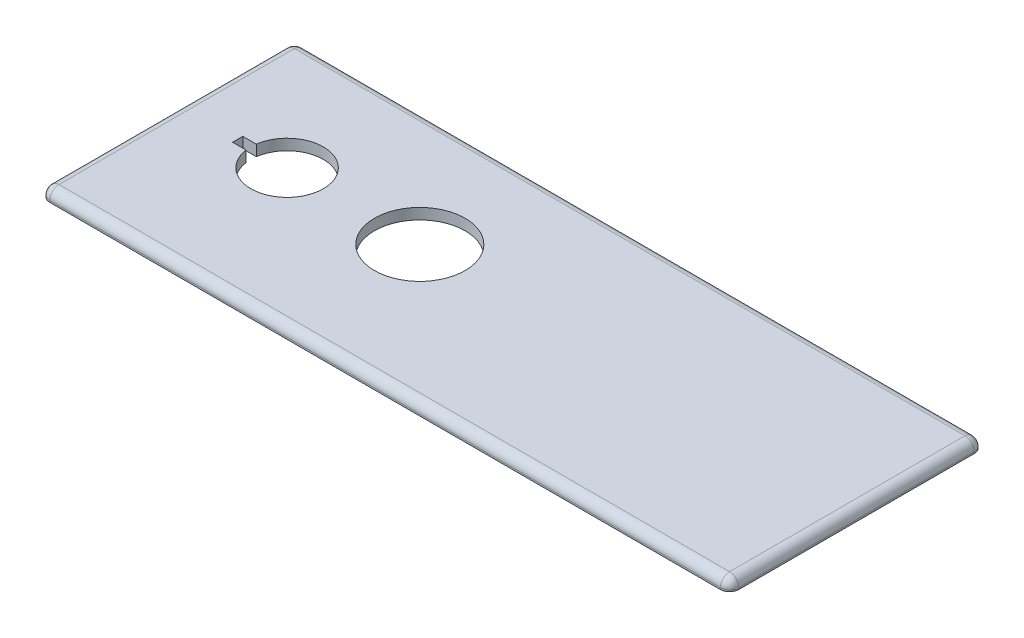
ISO-10303-21;
HEADER;
FILE_DESCRIPTION(('STEP AP214'),'2;1');
FILE_NAME('part.step','',(''),(''),'','','');
FILE_SCHEMA(('AUTOMOTIVE_DESIGN { 1 0 10303 214 1 1 1 1 }'));
ENDSEC;
DATA;
#1=APPLICATION_CONTEXT('core data for automotive mechanical design processes');
#2=APPLICATION_PROTOCOL_DEFINITION('international standard','automotive_design',2000,#1);
#3=PRODUCT_CONTEXT('',#1,'mechanical');
#4=PRODUCT('Part','Part','',(#3));
#5=PRODUCT_RELATED_PRODUCT_CATEGORY('part','',(#4));
#6=PRODUCT_DEFINITION_FORMATION('','',#4);
#7=PRODUCT_DEFINITION_CONTEXT('part definition',#1,'design');
#8=PRODUCT_DEFINITION('design','',#6,#7);
#9=PRODUCT_DEFINITION_SHAPE('','',#8);
#10=(LENGTH_UNIT() NAMED_UNIT(*) SI_UNIT(.MILLI.,.METRE.));
#11=(NAMED_UNIT(*) PLANE_ANGLE_UNIT() SI_UNIT($,.RADIAN.));
#12=(NAMED_UNIT(*) SI_UNIT($,.STERADIAN.) SOLID_ANGLE_UNIT());
#13=UNCERTAINTY_MEASURE_WITH_UNIT(LENGTH_MEASURE(1.E-05),#10,'distance_accuracy_value','');
#14=(GEOMETRIC_REPRESENTATION_CONTEXT(3) GLOBAL_UNCERTAINTY_ASSIGNED_CONTEXT((#13)) GLOBAL_UNIT_ASSIGNED_CONTEXT((#10,
#11,#12)) REPRESENTATION_CONTEXT('',''));
#15=CARTESIAN_POINT('',(0.,0.,0.));
#16=DIRECTION('',(0.,0.,1.));
#17=DIRECTION('',(1.,0.,0.));
#18=AXIS2_PLACEMENT_3D('',#15,#16,#17);
#19=CARTESIAN_POINT('',(95.,3.,35.));
#20=DIRECTION('',(-1.,0.,0.));
#21=DIRECTION('',(0.,0.,1.));
#22=AXIS2_PLACEMENT_3D('',#19,#20,#21);
#23=PLANE('',#22);
#24=DIRECTION('',(0.,-1.,0.));
#25=VECTOR('',#24,1.);
#26=CARTESIAN_POINT('',(95.,3.,-32.46));
#27=LINE('',#26,#25);
#28=CARTESIAN_POINT('',(95.,0.,-32.46));
#29=VERTEX_POINT('',#28);
#30=CARTESIAN_POINT('',(95.,0.46,-32.46));
#31=VERTEX_POINT('',#30);
#32=EDGE_CURVE('E195',#29,#31,#27,.F.);
#33=ORIENTED_EDGE('',*,*,#32,.T.);
#34=DIRECTION('',(0.,0.,-1.));
#35=VECTOR('',#34,1.);
#36=CARTESIAN_POINT('',(95.,0.46,35.));
#37=LINE('',#36,#35);
#38=CARTESIAN_POINT('',(95.,0.46,32.46));
#39=VERTEX_POINT('',#38);
#40=EDGE_CURVE('E232',#31,#39,#37,.F.);
#41=ORIENTED_EDGE('',*,*,#40,.T.);
#42=DIRECTION('',(0.,-1.,0.));
#43=VECTOR('',#42,1.);
#44=CARTESIAN_POINT('',(95.,3.,32.46));
#45=LINE('',#44,#43);
#46=CARTESIAN_POINT('',(95.,0.,32.46));
#47=VERTEX_POINT('',#46);
#48=EDGE_CURVE('E193',#39,#47,#45,.T.);
#49=ORIENTED_EDGE('',*,*,#48,.T.);
#50=DIRECTION('',(0.,0.,-1.));
#51=VECTOR('',#50,1.);
#52=CARTESIAN_POINT('',(95.,0.,35.));
#53=LINE('',#52,#51);
#54=EDGE_CURVE('E167',#47,#29,#53,.T.);
#55=ORIENTED_EDGE('',*,*,#54,.T.);
#56=EDGE_LOOP('',(#33,#41,#49,#55));
#57=FACE_BOUND('',#56,.T.);
#58=ADVANCED_FACE('F35',(#57),#23,.F.);
#59=CARTESIAN_POINT('',(-95.,3.,-35.));
#60=DIRECTION('',(0.,0.,1.));
#61=DIRECTION('',(1.,0.,0.));
#62=AXIS2_PLACEMENT_3D('',#59,#60,#61);
#63=PLANE('',#62);
#64=DIRECTION('',(0.,-1.,0.));
#65=VECTOR('',#64,1.);
#66=CARTESIAN_POINT('',(-92.46,3.,-35.));
#67=LINE('',#66,#65);
#68=CARTESIAN_POINT('',(-92.46,0.,-35.));
#69=VERTEX_POINT('',#68);
#70=CARTESIAN_POINT('',(-92.46,0.46,-35.));
#71=VERTEX_POINT('',#70);
#72=EDGE_CURVE('E180',#69,#71,#67,.F.);
#73=ORIENTED_EDGE('',*,*,#72,.T.);
#74=DIRECTION('',(-1.,0.,0.));
#75=VECTOR('',#74,1.);
#76=CARTESIAN_POINT('',(-95.,0.46,-35.));
#77=LINE('',#76,#75);
#78=CARTESIAN_POINT('',(92.46,0.46,-35.));
#79=VERTEX_POINT('',#78);
#80=EDGE_CURVE('E230',#71,#79,#77,.F.);
#81=ORIENTED_EDGE('',*,*,#80,.T.);
#82=DIRECTION('',(0.,-1.,0.));
#83=VECTOR('',#82,1.);
#84=CARTESIAN_POINT('',(92.46,3.,-35.));
#85=LINE('',#84,#83);
#86=CARTESIAN_POINT('',(92.46,0.,-35.));
#87=VERTEX_POINT('',#86);
#88=EDGE_CURVE('E183',#79,#87,#85,.T.);
#89=ORIENTED_EDGE('',*,*,#88,.T.);
#90=DIRECTION('',(-1.,0.,0.));
#91=VECTOR('',#90,1.);
#92=CARTESIAN_POINT('',(-95.,0.,-35.));
#93=LINE('',#92,#91);
#94=EDGE_CURVE('E170',#87,#69,#93,.T.);
#95=ORIENTED_EDGE('',*,*,#94,.T.);
#96=EDGE_LOOP('',(#73,#81,#89,#95));
#97=FACE_BOUND('',#96,.T.);
#98=ADVANCED_FACE('F282',(#97),#63,.F.);
#99=CARTESIAN_POINT('',(-95.,3.,35.));
#100=DIRECTION('',(1.,0.,0.));
#101=DIRECTION('',(0.,0.,-1.));
#102=AXIS2_PLACEMENT_3D('',#99,#100,#101);
#103=PLANE('',#102);
#104=DIRECTION('',(0.,-1.,0.));
#105=VECTOR('',#104,1.);
#106=CARTESIAN_POINT('',(-95.,3.,32.46));
#107=LINE('',#106,#105);
#108=CARTESIAN_POINT('',(-95.,0.,32.46));
#109=VERTEX_POINT('',#108);
#110=CARTESIAN_POINT('',(-95.,0.46,32.46));
#111=VERTEX_POINT('',#110);
#112=EDGE_CURVE('E205',#109,#111,#107,.F.);
#113=ORIENTED_EDGE('',*,*,#112,.T.);
#114=DIRECTION('',(0.,0.,1.));
#115=VECTOR('',#114,1.);
#116=CARTESIAN_POINT('',(-95.,0.46,35.));
#117=LINE('',#116,#115);
#118=CARTESIAN_POINT('',(-95.,0.46,-32.46));
#119=VERTEX_POINT('',#118);
#120=EDGE_CURVE('E226',#111,#119,#117,.F.);
#121=ORIENTED_EDGE('',*,*,#120,.T.);
#122=DIRECTION('',(0.,-1.,0.));
#123=VECTOR('',#122,1.);
#124=CARTESIAN_POINT('',(-95.,3.,-32.46));
#125=LINE('',#124,#123);
#126=CARTESIAN_POINT('',(-95.,0.,-32.46));
#127=VERTEX_POINT('',#126);
#128=EDGE_CURVE('E203',#119,#127,#125,.T.);
#129=ORIENTED_EDGE('',*,*,#128,.T.);
#130=DIRECTION('',(0.,0.,1.));
#131=VECTOR('',#130,1.);
#132=CARTESIAN_POINT('',(-95.,0.,35.));
#133=LINE('',#132,#131);
#134=EDGE_CURVE('E174',#127,#109,#133,.T.);
#135=ORIENTED_EDGE('',*,*,#134,.T.);
#136=EDGE_LOOP('',(#113,#121,#129,#135));
#137=FACE_BOUND('',#136,.T.);
#138=ADVANCED_FACE('F288',(#137),#103,.F.);
#139=CARTESIAN_POINT('',(-95.,3.,35.));
#140=DIRECTION('',(0.,0.,-1.));
#141=DIRECTION('',(-1.,0.,0.));
#142=AXIS2_PLACEMENT_3D('',#139,#140,#141);
#143=PLANE('',#142);
#144=DIRECTION('',(0.,-1.,0.));
#145=VECTOR('',#144,1.);
#146=CARTESIAN_POINT('',(92.46,3.,35.));
#147=LINE('',#146,#145);
#148=CARTESIAN_POINT('',(92.46,0.,35.));
#149=VERTEX_POINT('',#148);
#150=CARTESIAN_POINT('',(92.46,0.46,35.));
#151=VERTEX_POINT('',#150);
#152=EDGE_CURVE('E200',#149,#151,#147,.F.);
#153=ORIENTED_EDGE('',*,*,#152,.T.);
#154=DIRECTION('',(1.,0.,0.));
#155=VECTOR('',#154,1.);
#156=CARTESIAN_POINT('',(-95.,0.46,35.));
#157=LINE('',#156,#155);
#158=CARTESIAN_POINT('',(-92.46,0.46,35.));
#159=VERTEX_POINT('',#158);
#160=EDGE_CURVE('E228',#151,#159,#157,.F.);
#161=ORIENTED_EDGE('',*,*,#160,.T.);
#162=DIRECTION('',(0.,-1.,0.));
#163=VECTOR('',#162,1.);
#164=CARTESIAN_POINT('',(-92.46,3.,35.));
#165=LINE('',#164,#163);
#166=CARTESIAN_POINT('',(-92.46,0.,35.));
#167=VERTEX_POINT('',#166);
#168=EDGE_CURVE('E198',#159,#167,#165,.T.);
#169=ORIENTED_EDGE('',*,*,#168,.T.);
#170=DIRECTION('',(1.,0.,0.));
#171=VECTOR('',#170,1.);
#172=CARTESIAN_POINT('',(-95.,0.,35.));
#173=LINE('',#172,#171);
#174=EDGE_CURVE('E177',#167,#149,#173,.T.);
#175=ORIENTED_EDGE('',*,*,#174,.T.);
#176=EDGE_LOOP('',(#153,#161,#169,#175));
#177=FACE_BOUND('',#176,.T.);
#178=ADVANCED_FACE('F376',(#177),#143,.F.);
#179=CARTESIAN_POINT('',(0.,3.,0.));
#180=DIRECTION('',(0.,-1.,0.));
#181=DIRECTION('',(0.,0.,-1.));
#182=AXIS2_PLACEMENT_3D('',#179,#180,#181);
#183=PLANE('',#182);
#184=DIRECTION('',(1.,0.,0.));
#185=VECTOR('',#184,1.);
#186=CARTESIAN_POINT('',(0.,3.,-4.38393787876132));
#187=LINE('',#186,#185);
#188=CARTESIAN_POINT('',(-78.62783105339,3.,-4.38393787876132));
#189=VERTEX_POINT('',#188);
#190=CARTESIAN_POINT('',(-74.9012626555054,3.,-4.38393787876132));
#191=VERTEX_POINT('',#190);
#192=EDGE_CURVE('E147',#189,#191,#187,.T.);
#193=ORIENTED_EDGE('',*,*,#192,.T.);
#194=CARTESIAN_POINT('',(-65.,3.,-2.98215407706619));
#195=DIRECTION('',(0.,1.,0.));
#196=DIRECTION('',(0.,0.,1.));
#197=AXIS2_PLACEMENT_3D('',#194,#195,#196);
#198=CIRCLE('',#197,10.);
#199=CARTESIAN_POINT('',(-74.9012626555054,3.,-1.58037027537106));
#200=VERTEX_POINT('',#199);
#201=EDGE_CURVE('E50',#200,#191,#198,.T.);
#202=ORIENTED_EDGE('',*,*,#201,.F.);
#203=DIRECTION('',(1.,0.,0.));
#204=VECTOR('',#203,1.);
#205=CARTESIAN_POINT('',(0.,3.,-1.58037027537106));
#206=LINE('',#205,#204);
#207=CARTESIAN_POINT('',(-78.62783105339,3.,-1.58037027537106));
#208=VERTEX_POINT('',#207);
#209=EDGE_CURVE('E154',#208,#200,#206,.T.);
#210=ORIENTED_EDGE('',*,*,#209,.F.);
#211=DIRECTION('',(0.,0.,-1.));
#212=VECTOR('',#211,1.);
#213=CARTESIAN_POINT('',(-78.62783105339,3.,0.));
#214=LINE('',#213,#212);
#215=EDGE_CURVE('E138',#208,#189,#214,.T.);
#216=ORIENTED_EDGE('',*,*,#215,.T.);
#217=EDGE_LOOP('',(#193,#202,#210,#216));
#218=FACE_BOUND('',#217,.T.);
#219=CARTESIAN_POINT('',(-28.415448,3.,-2.98215407706619));
#220=DIRECTION('',(0.,1.,0.));
#221=DIRECTION('',(0.,0.,1.));
#222=AXIS2_PLACEMENT_3D('',#219,#220,#221);
#223=CIRCLE('',#222,12.5);
#224=CARTESIAN_POINT('',(-28.415448,3.,9.51784592293381));
#225=VERTEX_POINT('',#224);
#226=EDGE_CURVE('E161',#225,#225,#223,.T.);
#227=ORIENTED_EDGE('',*,*,#226,.F.);
#228=EDGE_LOOP('',(#227));
#229=FACE_BOUND('',#228,.T.);
#230=DIRECTION('',(-1.,0.,0.));
#231=VECTOR('',#230,1.);
#232=CARTESIAN_POINT('',(0.,3.,-32.46));
#233=LINE('',#232,#231);
#234=CARTESIAN_POINT('',(92.46,3.,-32.46));
#235=VERTEX_POINT('',#234);
#236=CARTESIAN_POINT('',(-92.46,3.,-32.46));
#237=VERTEX_POINT('',#236);
#238=EDGE_CURVE('E219',#235,#237,#233,.T.);
#239=ORIENTED_EDGE('',*,*,#238,.T.);
#240=DIRECTION('',(0.,0.,1.));
#241=VECTOR('',#240,1.);
#242=CARTESIAN_POINT('',(-92.46,3.,0.));
#243=LINE('',#242,#241);
#244=CARTESIAN_POINT('',(-92.46,3.,32.46));
#245=VERTEX_POINT('',#244);
#246=EDGE_CURVE('E223',#237,#245,#243,.T.);
#247=ORIENTED_EDGE('',*,*,#246,.T.);
#248=DIRECTION('',(1.,0.,0.));
#249=VECTOR('',#248,1.);
#250=CARTESIAN_POINT('',(0.,3.,32.46));
#251=LINE('',#250,#249);
#252=CARTESIAN_POINT('',(92.46,3.,32.46));
#253=VERTEX_POINT('',#252);
#254=EDGE_CURVE('E221',#245,#253,#251,.T.);
#255=ORIENTED_EDGE('',*,*,#254,.T.);
#256=DIRECTION('',(0.,0.,-1.));
#257=VECTOR('',#256,1.);
#258=CARTESIAN_POINT('',(92.46,3.,0.));
#259=LINE('',#258,#257);
#260=EDGE_CURVE('E217',#253,#235,#259,.T.);
#261=ORIENTED_EDGE('',*,*,#260,.T.);
#262=EDGE_LOOP('',(#239,#247,#255,#261));
#263=FACE_BOUND('',#262,.T.);
#264=ADVANCED_FACE('F151',(#218,#229,#263),#183,.F.);
#265=CARTESIAN_POINT('',(0.,0.,0.));
#266=DIRECTION('',(0.,-1.,0.));
#267=DIRECTION('',(0.,0.,-1.));
#268=AXIS2_PLACEMENT_3D('',#265,#266,#267);
#269=PLANE('',#268);
#270=CARTESIAN_POINT('',(-65.,0.,-2.98215407706619));
#271=DIRECTION('',(0.,-1.,0.));
#272=DIRECTION('',(0.,0.,-1.));
#273=AXIS2_PLACEMENT_3D('',#270,#271,#272);
#274=CIRCLE('',#273,10.);
#275=CARTESIAN_POINT('',(-74.9012626555054,0.,-4.38393787876132));
#276=VERTEX_POINT('',#275);
#277=CARTESIAN_POINT('',(-74.9012626555054,0.,-1.58037027537106));
#278=VERTEX_POINT('',#277);
#279=EDGE_CURVE('E11',#276,#278,#274,.T.);
#280=ORIENTED_EDGE('',*,*,#279,.F.);
#281=DIRECTION('',(-1.,0.,0.));
#282=VECTOR('',#281,1.);
#283=CARTESIAN_POINT('',(0.,0.,-4.38393787876132));
#284=LINE('',#283,#282);
#285=CARTESIAN_POINT('',(-78.62783105339,0.,-4.38393787876132));
#286=VERTEX_POINT('',#285);
#287=EDGE_CURVE('E234',#276,#286,#284,.T.);
#288=ORIENTED_EDGE('',*,*,#287,.T.);
#289=DIRECTION('',(0.,0.,1.));
#290=VECTOR('',#289,1.);
#291=CARTESIAN_POINT('',(-78.62783105339,0.,0.));
#292=LINE('',#291,#290);
#293=CARTESIAN_POINT('',(-78.62783105339,0.,-1.58037027537106));
#294=VERTEX_POINT('',#293);
#295=EDGE_CURVE('E141',#286,#294,#292,.T.);
#296=ORIENTED_EDGE('',*,*,#295,.T.);
#297=DIRECTION('',(-1.,0.,0.));
#298=VECTOR('',#297,1.);
#299=CARTESIAN_POINT('',(0.,0.,-1.58037027537106));
#300=LINE('',#299,#298);
#301=EDGE_CURVE('E43',#278,#294,#300,.T.);
#302=ORIENTED_EDGE('',*,*,#301,.F.);
#303=EDGE_LOOP('',(#280,#288,#296,#302));
#304=FACE_BOUND('',#303,.T.);
#305=CARTESIAN_POINT('',(-28.415448,0.,-2.98215407706619));
#306=DIRECTION('',(0.,-1.,0.));
#307=DIRECTION('',(0.,0.,-1.));
#308=AXIS2_PLACEMENT_3D('',#305,#306,#307);
#309=CIRCLE('',#308,12.5);
#310=CARTESIAN_POINT('',(-28.415448,0.,-15.4821540770662));
#311=VERTEX_POINT('',#310);
#312=EDGE_CURVE('E166',#311,#311,#309,.T.);
#313=ORIENTED_EDGE('',*,*,#312,.F.);
#314=EDGE_LOOP('',(#313));
#315=FACE_BOUND('',#314,.T.);
#316=ORIENTED_EDGE('',*,*,#94,.F.);
#317=CARTESIAN_POINT('',(92.46,0.,-32.46));
#318=DIRECTION('',(0.,-1.,0.));
#319=DIRECTION('',(0.,0.,-1.));
#320=AXIS2_PLACEMENT_3D('',#317,#318,#319);
#321=CIRCLE('',#320,2.54);
#322=EDGE_CURVE('E191',#87,#29,#321,.T.);
#323=ORIENTED_EDGE('',*,*,#322,.T.);
#324=ORIENTED_EDGE('',*,*,#54,.F.);
#325=CARTESIAN_POINT('',(92.46,0.,32.46));
#326=DIRECTION('',(0.,-1.,0.));
#327=DIRECTION('',(0.,0.,-1.));
#328=AXIS2_PLACEMENT_3D('',#325,#326,#327);
#329=CIRCLE('',#328,2.54);
#330=EDGE_CURVE('E189',#47,#149,#329,.T.);
#331=ORIENTED_EDGE('',*,*,#330,.T.);
#332=ORIENTED_EDGE('',*,*,#174,.F.);
#333=CARTESIAN_POINT('',(-92.46,0.,32.46));
#334=DIRECTION('',(0.,-1.,0.));
#335=DIRECTION('',(0.,0.,-1.));
#336=AXIS2_PLACEMENT_3D('',#333,#334,#335);
#337=CIRCLE('',#336,2.54);
#338=EDGE_CURVE('E187',#167,#109,#337,.T.);
#339=ORIENTED_EDGE('',*,*,#338,.T.);
#340=ORIENTED_EDGE('',*,*,#134,.F.);
#341=CARTESIAN_POINT('',(-92.46,0.,-32.46));
#342=DIRECTION('',(0.,-1.,0.));
#343=DIRECTION('',(0.,0.,-1.));
#344=AXIS2_PLACEMENT_3D('',#341,#342,#343);
#345=CIRCLE('',#344,2.54);
#346=EDGE_CURVE('E185',#127,#69,#345,.T.);
#347=ORIENTED_EDGE('',*,*,#346,.T.);
#348=EDGE_LOOP('',(#316,#323,#324,#331,#332,#339,#340,#347));
#349=FACE_BOUND('',#348,.T.);
#350=ADVANCED_FACE('F266',(#304,#315,#349),#269,.T.);
#351=CARTESIAN_POINT('',(92.46,3.,-32.46));
#352=DIRECTION('',(0.,-1.,0.));
#353=DIRECTION('',(0.,0.,-1.));
#354=AXIS2_PLACEMENT_3D('',#351,#352,#353);
#355=CYLINDRICAL_SURFACE('',#354,2.54);
#356=ORIENTED_EDGE('',*,*,#88,.F.);
#357=CARTESIAN_POINT('',(92.46,0.46,-32.46));
#358=DIRECTION('',(0.,-1.,0.));
#359=DIRECTION('',(0.,0.,-1.));
#360=AXIS2_PLACEMENT_3D('',#357,#358,#359);
#361=CIRCLE('',#360,2.54);
#362=EDGE_CURVE('E215',#79,#31,#361,.T.);
#363=ORIENTED_EDGE('',*,*,#362,.T.);
#364=ORIENTED_EDGE('',*,*,#32,.F.);
#365=ORIENTED_EDGE('',*,*,#322,.F.);
#366=EDGE_LOOP('',(#356,#363,#364,#365));
#367=FACE_BOUND('',#366,.T.);
#368=ADVANCED_FACE('F293',(#367),#355,.T.);
#369=CARTESIAN_POINT('',(92.46,3.,32.46));
#370=DIRECTION('',(0.,-1.,0.));
#371=DIRECTION('',(0.,0.,-1.));
#372=AXIS2_PLACEMENT_3D('',#369,#370,#371);
#373=CYLINDRICAL_SURFACE('',#372,2.54);
#374=ORIENTED_EDGE('',*,*,#48,.F.);
#375=CARTESIAN_POINT('',(92.46,0.46,32.46));
#376=DIRECTION('',(0.,-1.,0.));
#377=DIRECTION('',(0.,0.,-1.));
#378=AXIS2_PLACEMENT_3D('',#375,#376,#377);
#379=CIRCLE('',#378,2.54);
#380=EDGE_CURVE('E208',#39,#151,#379,.T.);
#381=ORIENTED_EDGE('',*,*,#380,.T.);
#382=ORIENTED_EDGE('',*,*,#152,.F.);
#383=ORIENTED_EDGE('',*,*,#330,.F.);
#384=EDGE_LOOP('',(#374,#381,#382,#383));
#385=FACE_BOUND('',#384,.T.);
#386=ADVANCED_FACE('F296',(#385),#373,.T.);
#387=CARTESIAN_POINT('',(-92.46,3.,32.46));
#388=DIRECTION('',(0.,-1.,0.));
#389=DIRECTION('',(0.,0.,-1.));
#390=AXIS2_PLACEMENT_3D('',#387,#388,#389);
#391=CYLINDRICAL_SURFACE('',#390,2.54);
#392=ORIENTED_EDGE('',*,*,#168,.F.);
#393=CARTESIAN_POINT('',(-92.46,0.46,32.46));
#394=DIRECTION('',(0.,-1.,0.));
#395=DIRECTION('',(0.,0.,-1.));
#396=AXIS2_PLACEMENT_3D('',#393,#394,#395);
#397=CIRCLE('',#396,2.54);
#398=EDGE_CURVE('E211',#159,#111,#397,.T.);
#399=ORIENTED_EDGE('',*,*,#398,.T.);
#400=ORIENTED_EDGE('',*,*,#112,.F.);
#401=ORIENTED_EDGE('',*,*,#338,.F.);
#402=EDGE_LOOP('',(#392,#399,#400,#401));
#403=FACE_BOUND('',#402,.T.);
#404=ADVANCED_FACE('F300',(#403),#391,.T.);
#405=CARTESIAN_POINT('',(-92.46,3.,-32.46));
#406=DIRECTION('',(0.,-1.,0.));
#407=DIRECTION('',(0.,0.,-1.));
#408=AXIS2_PLACEMENT_3D('',#405,#406,#407);
#409=CYLINDRICAL_SURFACE('',#408,2.54);
#410=ORIENTED_EDGE('',*,*,#128,.F.);
#411=CARTESIAN_POINT('',(-92.46,0.46,-32.46));
#412=DIRECTION('',(0.,-1.,0.));
#413=DIRECTION('',(0.,0.,-1.));
#414=AXIS2_PLACEMENT_3D('',#411,#412,#413);
#415=CIRCLE('',#414,2.54);
#416=EDGE_CURVE('E213',#119,#71,#415,.T.);
#417=ORIENTED_EDGE('',*,*,#416,.T.);
#418=ORIENTED_EDGE('',*,*,#72,.F.);
#419=ORIENTED_EDGE('',*,*,#346,.F.);
#420=EDGE_LOOP('',(#410,#417,#418,#419));
#421=FACE_BOUND('',#420,.T.);
#422=ADVANCED_FACE('F304',(#421),#409,.T.);
#423=CARTESIAN_POINT('',(-92.46,0.46,-32.46));
#424=DIRECTION('',(0.,-1.,0.));
#425=DIRECTION('',(0.,0.,-1.));
#426=AXIS2_PLACEMENT_3D('',#423,#424,#425);
#427=SPHERICAL_SURFACE('',#426,2.54);
#428=CARTESIAN_POINT('',(-92.46,0.46,-32.46));
#429=DIRECTION('',(1.,0.,0.));
#430=DIRECTION('',(0.,0.,-1.));
#431=AXIS2_PLACEMENT_3D('',#428,#429,#430);
#432=CIRCLE('',#431,2.54);
#433=EDGE_CURVE('E252',#71,#237,#432,.T.);
#434=ORIENTED_EDGE('',*,*,#433,.F.);
#435=ORIENTED_EDGE('',*,*,#416,.F.);
#436=CARTESIAN_POINT('',(-92.46,0.46,-32.46));
#437=DIRECTION('',(0.,0.,1.));
#438=DIRECTION('',(1.,0.,0.));
#439=AXIS2_PLACEMENT_3D('',#436,#437,#438);
#440=CIRCLE('',#439,2.54);
#441=EDGE_CURVE('E171',#237,#119,#440,.T.);
#442=ORIENTED_EDGE('',*,*,#441,.F.);
#443=EDGE_LOOP('',(#434,#435,#442));
#444=FACE_BOUND('',#443,.T.);
#445=ADVANCED_FACE('F37',(#444),#427,.T.);
#446=CARTESIAN_POINT('',(-92.46,0.46,0.));
#447=DIRECTION('',(0.,0.,1.));
#448=DIRECTION('',(1.,0.,0.));
#449=AXIS2_PLACEMENT_3D('',#446,#447,#448);
#450=CYLINDRICAL_SURFACE('',#449,2.54);
#451=ORIENTED_EDGE('',*,*,#441,.T.);
#452=ORIENTED_EDGE('',*,*,#120,.F.);
#453=CARTESIAN_POINT('',(-92.46,0.46,32.46));
#454=DIRECTION('',(0.,0.,1.));
#455=DIRECTION('',(1.,0.,0.));
#456=AXIS2_PLACEMENT_3D('',#453,#454,#455);
#457=CIRCLE('',#456,2.54);
#458=EDGE_CURVE('E249',#245,#111,#457,.T.);
#459=ORIENTED_EDGE('',*,*,#458,.F.);
#460=ORIENTED_EDGE('',*,*,#246,.F.);
#461=EDGE_LOOP('',(#451,#452,#459,#460));
#462=FACE_BOUND('',#461,.T.);
#463=ADVANCED_FACE('F330',(#462),#450,.T.);
#464=CARTESIAN_POINT('',(0.,0.46,-32.46));
#465=DIRECTION('',(-1.,0.,0.));
#466=DIRECTION('',(0.,0.,1.));
#467=AXIS2_PLACEMENT_3D('',#464,#465,#466);
#468=CYLINDRICAL_SURFACE('',#467,2.54);
#469=ORIENTED_EDGE('',*,*,#433,.T.);
#470=ORIENTED_EDGE('',*,*,#238,.F.);
#471=CARTESIAN_POINT('',(92.46,0.46,-32.46));
#472=DIRECTION('',(1.,0.,0.));
#473=DIRECTION('',(0.,0.,-1.));
#474=AXIS2_PLACEMENT_3D('',#471,#472,#473);
#475=CIRCLE('',#474,2.54);
#476=EDGE_CURVE('E246',#79,#235,#475,.T.);
#477=ORIENTED_EDGE('',*,*,#476,.F.);
#478=ORIENTED_EDGE('',*,*,#80,.F.);
#479=EDGE_LOOP('',(#469,#470,#477,#478));
#480=FACE_BOUND('',#479,.T.);
#481=ADVANCED_FACE('F327',(#480),#468,.T.);
#482=CARTESIAN_POINT('',(-92.46,0.46,32.46));
#483=DIRECTION('',(0.,-1.,0.));
#484=DIRECTION('',(0.,0.,-1.));
#485=AXIS2_PLACEMENT_3D('',#482,#483,#484);
#486=SPHERICAL_SURFACE('',#485,2.54);
#487=ORIENTED_EDGE('',*,*,#458,.T.);
#488=ORIENTED_EDGE('',*,*,#398,.F.);
#489=CARTESIAN_POINT('',(-92.46,0.46,32.46));
#490=DIRECTION('',(1.,0.,0.));
#491=DIRECTION('',(0.,0.,-1.));
#492=AXIS2_PLACEMENT_3D('',#489,#490,#491);
#493=CIRCLE('',#492,2.54);
#494=EDGE_CURVE('E243',#245,#159,#493,.T.);
#495=ORIENTED_EDGE('',*,*,#494,.F.);
#496=EDGE_LOOP('',(#487,#488,#495));
#497=FACE_BOUND('',#496,.T.);
#498=ADVANCED_FACE('F323',(#497),#486,.T.);
#499=CARTESIAN_POINT('',(92.46,0.46,-32.46));
#500=DIRECTION('',(0.,-1.,0.));
#501=DIRECTION('',(0.,0.,-1.));
#502=AXIS2_PLACEMENT_3D('',#499,#500,#501);
#503=SPHERICAL_SURFACE('',#502,2.54);
#504=ORIENTED_EDGE('',*,*,#362,.F.);
#505=ORIENTED_EDGE('',*,*,#476,.T.);
#506=CARTESIAN_POINT('',(92.46,0.46,-32.46));
#507=DIRECTION('',(0.,0.,1.));
#508=DIRECTION('',(1.,0.,0.));
#509=AXIS2_PLACEMENT_3D('',#506,#507,#508);
#510=CIRCLE('',#509,2.54);
#511=EDGE_CURVE('E240',#31,#235,#510,.T.);
#512=ORIENTED_EDGE('',*,*,#511,.F.);
#513=EDGE_LOOP('',(#504,#505,#512));
#514=FACE_BOUND('',#513,.T.);
#515=ADVANCED_FACE('F319',(#514),#503,.T.);
#516=CARTESIAN_POINT('',(0.,0.46,32.46));
#517=DIRECTION('',(1.,0.,0.));
#518=DIRECTION('',(0.,0.,-1.));
#519=AXIS2_PLACEMENT_3D('',#516,#517,#518);
#520=CYLINDRICAL_SURFACE('',#519,2.54);
#521=ORIENTED_EDGE('',*,*,#494,.T.);
#522=ORIENTED_EDGE('',*,*,#160,.F.);
#523=CARTESIAN_POINT('',(92.46,0.46,32.46));
#524=DIRECTION('',(1.,0.,0.));
#525=DIRECTION('',(0.,0.,-1.));
#526=AXIS2_PLACEMENT_3D('',#523,#524,#525);
#527=CIRCLE('',#526,2.54);
#528=EDGE_CURVE('E238',#253,#151,#527,.T.);
#529=ORIENTED_EDGE('',*,*,#528,.F.);
#530=ORIENTED_EDGE('',*,*,#254,.F.);
#531=EDGE_LOOP('',(#521,#522,#529,#530));
#532=FACE_BOUND('',#531,.T.);
#533=ADVANCED_FACE('F315',(#532),#520,.T.);
#534=CARTESIAN_POINT('',(92.46,0.46,0.));
#535=DIRECTION('',(0.,0.,-1.));
#536=DIRECTION('',(-1.,0.,0.));
#537=AXIS2_PLACEMENT_3D('',#534,#535,#536);
#538=CYLINDRICAL_SURFACE('',#537,2.54);
#539=ORIENTED_EDGE('',*,*,#511,.T.);
#540=ORIENTED_EDGE('',*,*,#260,.F.);
#541=CARTESIAN_POINT('',(92.46,0.46,32.46));
#542=DIRECTION('',(0.,0.,1.));
#543=DIRECTION('',(1.,0.,0.));
#544=AXIS2_PLACEMENT_3D('',#541,#542,#543);
#545=CIRCLE('',#544,2.54);
#546=EDGE_CURVE('E235',#39,#253,#545,.T.);
#547=ORIENTED_EDGE('',*,*,#546,.F.);
#548=ORIENTED_EDGE('',*,*,#40,.F.);
#549=EDGE_LOOP('',(#539,#540,#547,#548));
#550=FACE_BOUND('',#549,.T.);
#551=ADVANCED_FACE('F311',(#550),#538,.T.);
#552=CARTESIAN_POINT('',(92.46,0.46,32.46));
#553=DIRECTION('',(0.,-1.,0.));
#554=DIRECTION('',(0.,0.,-1.));
#555=AXIS2_PLACEMENT_3D('',#552,#553,#554);
#556=SPHERICAL_SURFACE('',#555,2.54);
#557=ORIENTED_EDGE('',*,*,#528,.T.);
#558=ORIENTED_EDGE('',*,*,#380,.F.);
#559=ORIENTED_EDGE('',*,*,#546,.T.);
#560=EDGE_LOOP('',(#557,#558,#559));
#561=FACE_BOUND('',#560,.T.);
#562=ADVANCED_FACE('F277',(#561),#556,.T.);
#563=CARTESIAN_POINT('',(-28.415448,-3.5782226234174,-2.98215407706619));
#564=DIRECTION('',(0.,1.,0.));
#565=DIRECTION('',(0.,0.,1.));
#566=AXIS2_PLACEMENT_3D('',#563,#564,#565);
#567=CYLINDRICAL_SURFACE('',#566,12.5);
#568=ORIENTED_EDGE('',*,*,#312,.T.);
#569=EDGE_LOOP('',(#568));
#570=FACE_BOUND('',#569,.T.);
#571=ORIENTED_EDGE('',*,*,#226,.T.);
#572=EDGE_LOOP('',(#571));
#573=FACE_BOUND('',#572,.T.);
#574=ADVANCED_FACE('F270',(#570,#573),#567,.F.);
#575=CARTESIAN_POINT('',(-65.,-3.5782226234174,-2.98215407706619));
#576=DIRECTION('',(0.,1.,0.));
#577=DIRECTION('',(0.,0.,1.));
#578=AXIS2_PLACEMENT_3D('',#575,#576,#577);
#579=CYLINDRICAL_SURFACE('',#578,10.);
#580=ORIENTED_EDGE('',*,*,#279,.T.);
#581=DIRECTION('',(0.,1.,0.));
#582=VECTOR('',#581,1.);
#583=CARTESIAN_POINT('',(-74.9012626555054,-3.5782226234174,-1.58037027537106));
#584=LINE('',#583,#582);
#585=EDGE_CURVE('E159',#278,#200,#584,.T.);
#586=ORIENTED_EDGE('',*,*,#585,.T.);
#587=ORIENTED_EDGE('',*,*,#201,.T.);
#588=DIRECTION('',(0.,1.,0.));
#589=VECTOR('',#588,1.);
#590=CARTESIAN_POINT('',(-74.9012626555054,-3.5782226234174,-4.38393787876132));
#591=LINE('',#590,#589);
#592=EDGE_CURVE('E144',#276,#191,#591,.T.);
#593=ORIENTED_EDGE('',*,*,#592,.F.);
#594=EDGE_LOOP('',(#580,#586,#587,#593));
#595=FACE_BOUND('',#594,.T.);
#596=ADVANCED_FACE('F268',(#595),#579,.F.);
#597=CARTESIAN_POINT('',(0.,-3.5782226234174,-1.58037027537106));
#598=DIRECTION('',(0.,0.,1.));
#599=DIRECTION('',(1.,0.,0.));
#600=AXIS2_PLACEMENT_3D('',#597,#598,#599);
#601=PLANE('',#600);
#602=ORIENTED_EDGE('',*,*,#301,.T.);
#603=DIRECTION('',(0.,1.,0.));
#604=VECTOR('',#603,1.);
#605=CARTESIAN_POINT('',(-78.62783105339,-3.5782226234174,-1.58037027537106));
#606=LINE('',#605,#604);
#607=EDGE_CURVE('E143',#294,#208,#606,.T.);
#608=ORIENTED_EDGE('',*,*,#607,.T.);
#609=ORIENTED_EDGE('',*,*,#209,.T.);
#610=ORIENTED_EDGE('',*,*,#585,.F.);
#611=EDGE_LOOP('',(#602,#608,#609,#610));
#612=FACE_BOUND('',#611,.T.);
#613=ADVANCED_FACE('F263',(#612),#601,.F.);
#614=CARTESIAN_POINT('',(-78.62783105339,-3.5782226234174,0.));
#615=DIRECTION('',(1.,0.,0.));
#616=DIRECTION('',(0.,0.,-1.));
#617=AXIS2_PLACEMENT_3D('',#614,#615,#616);
#618=PLANE('',#617);
#619=DIRECTION('',(0.,1.,0.));
#620=VECTOR('',#619,1.);
#621=CARTESIAN_POINT('',(-78.62783105339,-3.5782226234174,-4.38393787876132));
#622=LINE('',#621,#620);
#623=EDGE_CURVE('E58',#286,#189,#622,.T.);
#624=ORIENTED_EDGE('',*,*,#623,.T.);
#625=ORIENTED_EDGE('',*,*,#215,.F.);
#626=ORIENTED_EDGE('',*,*,#607,.F.);
#627=ORIENTED_EDGE('',*,*,#295,.F.);
#628=EDGE_LOOP('',(#624,#625,#626,#627));
#629=FACE_BOUND('',#628,.T.);
#630=ADVANCED_FACE('F135',(#629),#618,.T.);
#631=CARTESIAN_POINT('',(0.,-3.5782226234174,-4.38393787876132));
#632=DIRECTION('',(0.,0.,1.));
#633=DIRECTION('',(1.,0.,0.));
#634=AXIS2_PLACEMENT_3D('',#631,#632,#633);
#635=PLANE('',#634);
#636=ORIENTED_EDGE('',*,*,#592,.T.);
#637=ORIENTED_EDGE('',*,*,#192,.F.);
#638=ORIENTED_EDGE('',*,*,#623,.F.);
#639=ORIENTED_EDGE('',*,*,#287,.F.);
#640=EDGE_LOOP('',(#636,#637,#638,#639));
#641=FACE_BOUND('',#640,.T.);
#642=ADVANCED_FACE('F148',(#641),#635,.T.);
#643=CLOSED_SHELL('',(#58,#98,#138,#178,#264,#350,#368,#386,#404,#422,#445,#463,#481,#498,#515,
#533,#551,#562,#574,#596,#613,#630,#642));
#644=MANIFOLD_SOLID_BREP('B2',#643);
#645=ADVANCED_BREP_SHAPE_REPRESENTATION('',(#18,#644),#14);
#646=SHAPE_DEFINITION_REPRESENTATION(#9,#645);
ENDSEC;
END-ISO-10303-21;
